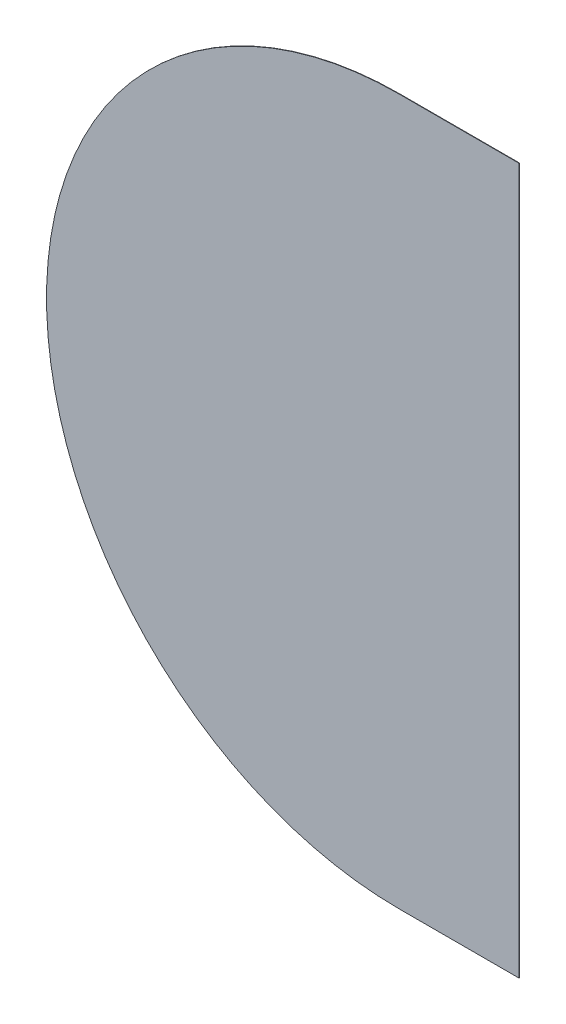
ISO-10303-21;
HEADER;
FILE_DESCRIPTION(('STEP AP214'),'2;1');
FILE_NAME('part.step','',(''),(''),'','','');
FILE_SCHEMA(('AUTOMOTIVE_DESIGN { 1 0 10303 214 1 1 1 1 }'));
ENDSEC;
DATA;
#1=APPLICATION_CONTEXT('core data for automotive mechanical design processes');
#2=APPLICATION_PROTOCOL_DEFINITION('international standard','automotive_design',2000,#1);
#3=PRODUCT_CONTEXT('',#1,'mechanical');
#4=PRODUCT('Part','Part','',(#3));
#5=PRODUCT_RELATED_PRODUCT_CATEGORY('part','',(#4));
#6=PRODUCT_DEFINITION_FORMATION('','',#4);
#7=PRODUCT_DEFINITION_CONTEXT('part definition',#1,'design');
#8=PRODUCT_DEFINITION('design','',#6,#7);
#9=PRODUCT_DEFINITION_SHAPE('','',#8);
#10=(LENGTH_UNIT() NAMED_UNIT(*) SI_UNIT(.MILLI.,.METRE.));
#11=(NAMED_UNIT(*) PLANE_ANGLE_UNIT() SI_UNIT($,.RADIAN.));
#12=(NAMED_UNIT(*) SI_UNIT($,.STERADIAN.) SOLID_ANGLE_UNIT());
#13=UNCERTAINTY_MEASURE_WITH_UNIT(LENGTH_MEASURE(1.E-05),#10,'distance_accuracy_value','');
#14=(GEOMETRIC_REPRESENTATION_CONTEXT(3) GLOBAL_UNCERTAINTY_ASSIGNED_CONTEXT((#13)) GLOBAL_UNIT_ASSIGNED_CONTEXT((#10,
#11,#12)) REPRESENTATION_CONTEXT('',''));
#15=CARTESIAN_POINT('',(0.,0.,0.));
#16=DIRECTION('',(0.,0.,1.));
#17=DIRECTION('',(1.,0.,0.));
#18=AXIS2_PLACEMENT_3D('',#15,#16,#17);
#19=CARTESIAN_POINT('',(-2.22044604925031E-13,797.5,1.));
#20=DIRECTION('',(0.,0.,-1.));
#21=DIRECTION('',(-1.,0.,0.));
#22=AXIS2_PLACEMENT_3D('',#19,#20,#21);
#23=CYLINDRICAL_SURFACE('',#22,797.5);
#24=CARTESIAN_POINT('',(-2.22044604925031E-13,797.5,0.));
#25=DIRECTION('',(0.,0.,1.));
#26=DIRECTION('',(1.,0.,0.));
#27=AXIS2_PLACEMENT_3D('',#24,#25,#26);
#28=CIRCLE('',#27,797.5);
#29=CARTESIAN_POINT('',(-4.44089209850063E-13,1595.,0.));
#30=VERTEX_POINT('',#29);
#31=CARTESIAN_POINT('',(0.,0.,0.));
#32=VERTEX_POINT('',#31);
#33=EDGE_CURVE('E107',#30,#32,#28,.T.);
#34=ORIENTED_EDGE('',*,*,#33,.T.);
#35=DIRECTION('',(0.,0.,-1.));
#36=VECTOR('',#35,1.);
#37=CARTESIAN_POINT('',(0.,0.,1.));
#38=LINE('',#37,#36);
#39=CARTESIAN_POINT('',(0.,0.,1.));
#40=VERTEX_POINT('',#39);
#41=EDGE_CURVE('E11',#40,#32,#38,.T.);
#42=ORIENTED_EDGE('',*,*,#41,.F.);
#43=CARTESIAN_POINT('',(-2.22044604925031E-13,797.5,1.));
#44=DIRECTION('',(0.,0.,1.));
#45=DIRECTION('',(1.,0.,0.));
#46=AXIS2_PLACEMENT_3D('',#43,#44,#45);
#47=CIRCLE('',#46,797.5);
#48=CARTESIAN_POINT('',(-4.44089209850063E-13,1595.,1.));
#49=VERTEX_POINT('',#48);
#50=EDGE_CURVE('E91',#49,#40,#47,.T.);
#51=ORIENTED_EDGE('',*,*,#50,.F.);
#52=DIRECTION('',(0.,0.,-1.));
#53=VECTOR('',#52,1.);
#54=CARTESIAN_POINT('',(-4.44089209850063E-13,1595.,1.));
#55=LINE('',#54,#53);
#56=EDGE_CURVE('E103',#49,#30,#55,.T.);
#57=ORIENTED_EDGE('',*,*,#56,.T.);
#58=EDGE_LOOP('',(#34,#42,#51,#57));
#59=FACE_BOUND('',#58,.T.);
#60=ADVANCED_FACE('F39',(#59),#23,.T.);
#61=CARTESIAN_POINT('',(0.,0.,1.));
#62=DIRECTION('',(0.,1.,0.));
#63=DIRECTION('',(0.,0.,1.));
#64=AXIS2_PLACEMENT_3D('',#61,#62,#63);
#65=PLANE('',#64);
#66=DIRECTION('',(1.,0.,0.));
#67=VECTOR('',#66,1.);
#68=CARTESIAN_POINT('',(0.,0.,0.));
#69=LINE('',#68,#67);
#70=CARTESIAN_POINT('',(270.,0.,0.));
#71=VERTEX_POINT('',#70);
#72=EDGE_CURVE('E96',#32,#71,#69,.T.);
#73=ORIENTED_EDGE('',*,*,#72,.T.);
#74=DIRECTION('',(0.,0.,-1.));
#75=VECTOR('',#74,1.);
#76=CARTESIAN_POINT('',(270.,0.,1.));
#77=LINE('',#76,#75);
#78=CARTESIAN_POINT('',(270.,0.,1.));
#79=VERTEX_POINT('',#78);
#80=EDGE_CURVE('E48',#79,#71,#77,.T.);
#81=ORIENTED_EDGE('',*,*,#80,.F.);
#82=DIRECTION('',(1.,0.,0.));
#83=VECTOR('',#82,1.);
#84=CARTESIAN_POINT('',(0.,0.,1.));
#85=LINE('',#84,#83);
#86=EDGE_CURVE('E86',#40,#79,#85,.T.);
#87=ORIENTED_EDGE('',*,*,#86,.F.);
#88=ORIENTED_EDGE('',*,*,#41,.T.);
#89=EDGE_LOOP('',(#73,#81,#87,#88));
#90=FACE_BOUND('',#89,.T.);
#91=ADVANCED_FACE('F95',(#90),#65,.F.);
#92=CARTESIAN_POINT('',(270.,0.,1.));
#93=DIRECTION('',(-1.,0.,0.));
#94=DIRECTION('',(0.,0.,1.));
#95=AXIS2_PLACEMENT_3D('',#92,#93,#94);
#96=PLANE('',#95);
#97=DIRECTION('',(0.,1.,0.));
#98=VECTOR('',#97,1.);
#99=CARTESIAN_POINT('',(270.,0.,0.));
#100=LINE('',#99,#98);
#101=CARTESIAN_POINT('',(270.,1595.,0.));
#102=VERTEX_POINT('',#101);
#103=EDGE_CURVE('E73',#71,#102,#100,.T.);
#104=ORIENTED_EDGE('',*,*,#103,.T.);
#105=DIRECTION('',(0.,0.,-1.));
#106=VECTOR('',#105,1.);
#107=CARTESIAN_POINT('',(270.,1595.,1.));
#108=LINE('',#107,#106);
#109=CARTESIAN_POINT('',(270.,1595.,1.));
#110=VERTEX_POINT('',#109);
#111=EDGE_CURVE('E98',#110,#102,#108,.T.);
#112=ORIENTED_EDGE('',*,*,#111,.F.);
#113=DIRECTION('',(0.,1.,0.));
#114=VECTOR('',#113,1.);
#115=CARTESIAN_POINT('',(270.,0.,1.));
#116=LINE('',#115,#114);
#117=EDGE_CURVE('E89',#79,#110,#116,.T.);
#118=ORIENTED_EDGE('',*,*,#117,.F.);
#119=ORIENTED_EDGE('',*,*,#80,.T.);
#120=EDGE_LOOP('',(#104,#112,#118,#119));
#121=FACE_BOUND('',#120,.T.);
#122=ADVANCED_FACE('F99',(#121),#96,.F.);
#123=CARTESIAN_POINT('',(-4.44089209850063E-13,1595.,1.));
#124=DIRECTION('',(0.,-1.,0.));
#125=DIRECTION('',(0.,0.,-1.));
#126=AXIS2_PLACEMENT_3D('',#123,#124,#125);
#127=PLANE('',#126);
#128=DIRECTION('',(-1.,0.,0.));
#129=VECTOR('',#128,1.);
#130=CARTESIAN_POINT('',(-4.44089209850063E-13,1595.,0.));
#131=LINE('',#130,#129);
#132=EDGE_CURVE('E79',#102,#30,#131,.T.);
#133=ORIENTED_EDGE('',*,*,#132,.T.);
#134=ORIENTED_EDGE('',*,*,#56,.F.);
#135=DIRECTION('',(-1.,0.,0.));
#136=VECTOR('',#135,1.);
#137=CARTESIAN_POINT('',(-4.44089209850063E-13,1595.,1.));
#138=LINE('',#137,#136);
#139=EDGE_CURVE('E56',#110,#49,#138,.T.);
#140=ORIENTED_EDGE('',*,*,#139,.F.);
#141=ORIENTED_EDGE('',*,*,#111,.T.);
#142=EDGE_LOOP('',(#133,#134,#140,#141));
#143=FACE_BOUND('',#142,.T.);
#144=ADVANCED_FACE('F120',(#143),#127,.F.);
#145=CARTESIAN_POINT('',(-2.22044604925031E-13,797.5,1.));
#146=DIRECTION('',(0.,0.,1.));
#147=DIRECTION('',(1.,0.,0.));
#148=AXIS2_PLACEMENT_3D('',#145,#146,#147);
#149=PLANE('',#148);
#150=ORIENTED_EDGE('',*,*,#50,.T.);
#151=ORIENTED_EDGE('',*,*,#86,.T.);
#152=ORIENTED_EDGE('',*,*,#117,.T.);
#153=ORIENTED_EDGE('',*,*,#139,.T.);
#154=EDGE_LOOP('',(#150,#151,#152,#153));
#155=FACE_BOUND('',#154,.T.);
#156=ADVANCED_FACE('F87',(#155),#149,.T.);
#157=CARTESIAN_POINT('',(-2.22044604925031E-13,797.5,0.));
#158=DIRECTION('',(0.,0.,1.));
#159=DIRECTION('',(1.,0.,0.));
#160=AXIS2_PLACEMENT_3D('',#157,#158,#159);
#161=PLANE('',#160);
#162=ORIENTED_EDGE('',*,*,#33,.F.);
#163=ORIENTED_EDGE('',*,*,#132,.F.);
#164=ORIENTED_EDGE('',*,*,#103,.F.);
#165=ORIENTED_EDGE('',*,*,#72,.F.);
#166=EDGE_LOOP('',(#162,#163,#164,#165));
#167=FACE_BOUND('',#166,.T.);
#168=ADVANCED_FACE('F123',(#167),#161,.F.);
#169=CLOSED_SHELL('',(#60,#91,#122,#144,#156,#168));
#170=MANIFOLD_SOLID_BREP('B2',#169);
#171=ADVANCED_BREP_SHAPE_REPRESENTATION('',(#18,#170),#14);
#172=SHAPE_DEFINITION_REPRESENTATION(#9,#171);
ENDSEC;
END-ISO-10303-21;
